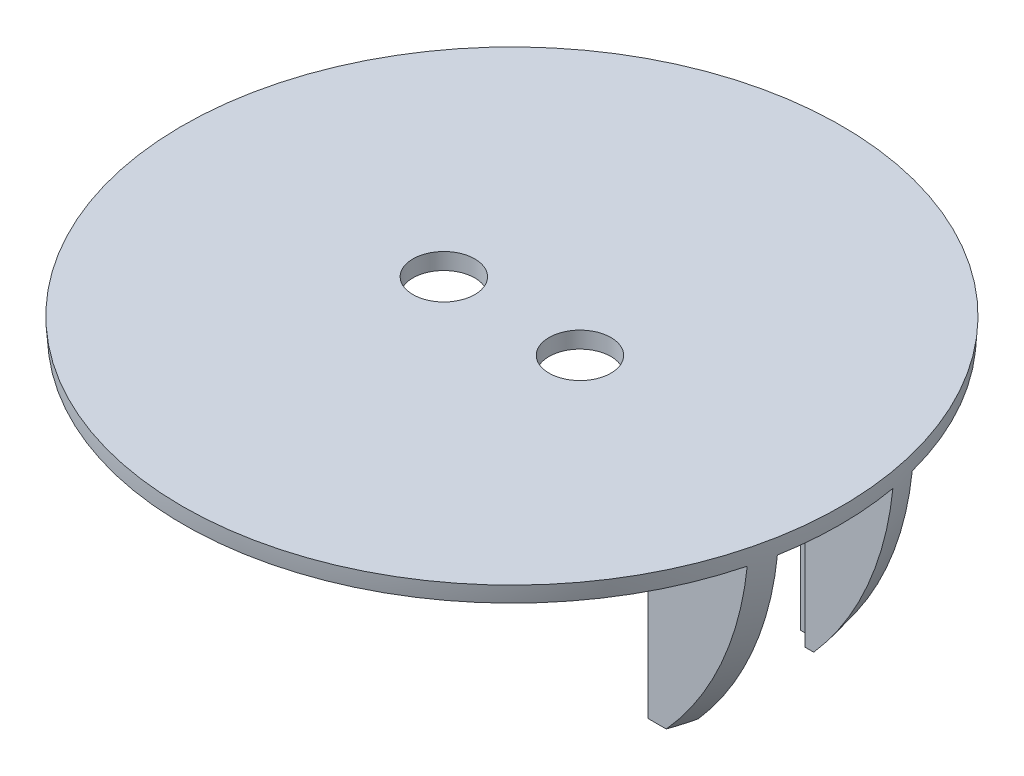
ISO-10303-21;
HEADER;
FILE_DESCRIPTION(('STEP AP214'),'2;1');
FILE_NAME('part.step','',(''),(''),'','','');
FILE_SCHEMA(('AUTOMOTIVE_DESIGN { 1 0 10303 214 1 1 1 1 }'));
ENDSEC;
DATA;
#1=APPLICATION_CONTEXT('core data for automotive mechanical design processes');
#2=APPLICATION_PROTOCOL_DEFINITION('international standard','automotive_design',2000,#1);
#3=PRODUCT_CONTEXT('',#1,'mechanical');
#4=PRODUCT('Part','Part','',(#3));
#5=PRODUCT_RELATED_PRODUCT_CATEGORY('part','',(#4));
#6=PRODUCT_DEFINITION_FORMATION('','',#4);
#7=PRODUCT_DEFINITION_CONTEXT('part definition',#1,'design');
#8=PRODUCT_DEFINITION('design','',#6,#7);
#9=PRODUCT_DEFINITION_SHAPE('','',#8);
#10=(LENGTH_UNIT() NAMED_UNIT(*) SI_UNIT(.MILLI.,.METRE.));
#11=(NAMED_UNIT(*) PLANE_ANGLE_UNIT() SI_UNIT($,.RADIAN.));
#12=(NAMED_UNIT(*) SI_UNIT($,.STERADIAN.) SOLID_ANGLE_UNIT());
#13=UNCERTAINTY_MEASURE_WITH_UNIT(LENGTH_MEASURE(1.E-05),#10,'distance_accuracy_value','');
#14=(GEOMETRIC_REPRESENTATION_CONTEXT(3) GLOBAL_UNCERTAINTY_ASSIGNED_CONTEXT((#13)) GLOBAL_UNIT_ASSIGNED_CONTEXT((#10,
#11,#12)) REPRESENTATION_CONTEXT('',''));
#15=CARTESIAN_POINT('',(0.,0.,0.));
#16=DIRECTION('',(0.,0.,1.));
#17=DIRECTION('',(1.,0.,0.));
#18=AXIS2_PLACEMENT_3D('',#15,#16,#17);
#19=CARTESIAN_POINT('',(41.,-4.00000000000001,0.));
#20=DIRECTION('',(0.,1.,0.));
#21=DIRECTION('',(0.,0.,1.));
#22=AXIS2_PLACEMENT_3D('',#19,#20,#21);
#23=PLANE('',#22);
#24=CARTESIAN_POINT('',(32.75,-4.00000000000001,0.));
#25=DIRECTION('',(0.,-1.,0.));
#26=DIRECTION('',(0.,0.,-1.));
#27=AXIS2_PLACEMENT_3D('',#24,#25,#26);
#28=CIRCLE('',#27,3.75000000000001);
#29=CARTESIAN_POINT('',(32.75,-4.00000000000001,-3.75000000000001));
#30=VERTEX_POINT('',#29);
#31=EDGE_CURVE('E524',#30,#30,#28,.T.);
#32=ORIENTED_EDGE('',*,*,#31,.F.);
#33=EDGE_LOOP('',(#32));
#34=FACE_BOUND('',#33,.T.);
#35=CARTESIAN_POINT('',(49.25,-4.00000000000001,0.));
#36=DIRECTION('',(0.,-1.,0.));
#37=DIRECTION('',(0.,0.,-1.));
#38=AXIS2_PLACEMENT_3D('',#35,#36,#37);
#39=CIRCLE('',#38,3.75000000000001);
#40=CARTESIAN_POINT('',(49.25,-4.00000000000001,-3.75000000000001));
#41=VERTEX_POINT('',#40);
#42=EDGE_CURVE('E516',#41,#41,#39,.T.);
#43=ORIENTED_EDGE('',*,*,#42,.F.);
#44=EDGE_LOOP('',(#43));
#45=FACE_BOUND('',#44,.T.);
#46=DIRECTION('',(1.,0.,0.));
#47=VECTOR('',#46,1.);
#48=CARTESIAN_POINT('',(67.5,-4.00000000000001,-10.));
#49=LINE('',#48,#47);
#50=CARTESIAN_POINT('',(67.5,-4.00000000000001,-10.));
#51=VERTEX_POINT('',#50);
#52=CARTESIAN_POINT('',(79.5227205685165,-4.00000000000001,-9.99999999999997));
#53=VERTEX_POINT('',#52);
#54=EDGE_CURVE('E60',#51,#53,#49,.T.);
#55=ORIENTED_EDGE('',*,*,#54,.F.);
#56=DIRECTION('',(0.,0.,-1.));
#57=VECTOR('',#56,1.);
#58=CARTESIAN_POINT('',(67.5,-4.00000000000001,-8.50000000000001));
#59=LINE('',#58,#57);
#60=CARTESIAN_POINT('',(67.5,-4.00000000000001,-8.50000000000001));
#61=VERTEX_POINT('',#60);
#62=EDGE_CURVE('E65',#61,#51,#59,.T.);
#63=ORIENTED_EDGE('',*,*,#62,.F.);
#64=DIRECTION('',(-1.,0.,0.));
#65=VECTOR('',#64,1.);
#66=CARTESIAN_POINT('',(67.5,-4.00000000000001,-8.50000000000001));
#67=LINE('',#66,#65);
#68=CARTESIAN_POINT('',(69.5,-4.00000000000001,-8.50000000000001));
#69=VERTEX_POINT('',#68);
#70=EDGE_CURVE('E235',#69,#61,#67,.T.);
#71=ORIENTED_EDGE('',*,*,#70,.F.);
#72=DIRECTION('',(0.,0.,-1.));
#73=VECTOR('',#72,1.);
#74=CARTESIAN_POINT('',(69.5,-4.00000000000001,-8.50000000000001));
#75=LINE('',#74,#73);
#76=CARTESIAN_POINT('',(69.5,-4.00000000000001,-7.00000000000001));
#77=VERTEX_POINT('',#76);
#78=EDGE_CURVE('E234',#77,#69,#75,.T.);
#79=ORIENTED_EDGE('',*,*,#78,.F.);
#80=DIRECTION('',(-1.,0.,0.));
#81=VECTOR('',#80,1.);
#82=CARTESIAN_POINT('',(80.1790760483195,-4.00000000000001,-6.99999999999997));
#83=LINE('',#82,#81);
#84=CARTESIAN_POINT('',(80.1790760483195,-4.00000000000001,-6.99999999999997));
#85=VERTEX_POINT('',#84);
#86=EDGE_CURVE('E217',#85,#77,#83,.T.);
#87=ORIENTED_EDGE('',*,*,#86,.F.);
#88=CARTESIAN_POINT('',(41.,-4.00000000000001,0.));
#89=DIRECTION('',(0.,1.,0.));
#90=DIRECTION('',(0.,0.,1.));
#91=AXIS2_PLACEMENT_3D('',#88,#89,#90);
#92=CIRCLE('',#91,39.7994974842648);
#93=CARTESIAN_POINT('',(80.1790760483195,-4.00000000000001,6.99999999999999));
#94=VERTEX_POINT('',#93);
#95=EDGE_CURVE('E53',#94,#85,#92,.T.);
#96=ORIENTED_EDGE('',*,*,#95,.F.);
#97=DIRECTION('',(1.,0.,0.));
#98=VECTOR('',#97,1.);
#99=CARTESIAN_POINT('',(80.1790760483195,-4.00000000000001,6.99999999999999));
#100=LINE('',#99,#98);
#101=CARTESIAN_POINT('',(69.5,-4.00000000000001,6.99999999999999));
#102=VERTEX_POINT('',#101);
#103=EDGE_CURVE('E341',#102,#94,#100,.T.);
#104=ORIENTED_EDGE('',*,*,#103,.F.);
#105=DIRECTION('',(0.,0.,-1.));
#106=VECTOR('',#105,1.);
#107=CARTESIAN_POINT('',(69.5,-4.00000000000001,8.49999999999999));
#108=LINE('',#107,#106);
#109=CARTESIAN_POINT('',(69.5,-4.00000000000001,8.49999999999999));
#110=VERTEX_POINT('',#109);
#111=EDGE_CURVE('E347',#110,#102,#108,.T.);
#112=ORIENTED_EDGE('',*,*,#111,.F.);
#113=DIRECTION('',(1.,0.,0.));
#114=VECTOR('',#113,1.);
#115=CARTESIAN_POINT('',(67.5,-4.00000000000001,8.49999999999999));
#116=LINE('',#115,#114);
#117=CARTESIAN_POINT('',(67.5,-4.00000000000001,8.49999999999999));
#118=VERTEX_POINT('',#117);
#119=EDGE_CURVE('E352',#118,#110,#116,.T.);
#120=ORIENTED_EDGE('',*,*,#119,.F.);
#121=DIRECTION('',(0.,0.,-1.));
#122=VECTOR('',#121,1.);
#123=CARTESIAN_POINT('',(67.5,-4.00000000000001,8.49999999999999));
#124=LINE('',#123,#122);
#125=CARTESIAN_POINT('',(67.5,-4.00000000000001,9.99999999999999));
#126=VERTEX_POINT('',#125);
#127=EDGE_CURVE('E357',#126,#118,#124,.T.);
#128=ORIENTED_EDGE('',*,*,#127,.F.);
#129=DIRECTION('',(-1.,0.,0.));
#130=VECTOR('',#129,1.);
#131=CARTESIAN_POINT('',(67.5,-4.00000000000001,9.99999999999999));
#132=LINE('',#131,#130);
#133=CARTESIAN_POINT('',(79.5227205685165,-4.00000000000001,9.99999999999999));
#134=VERTEX_POINT('',#133);
#135=EDGE_CURVE('E361',#134,#126,#132,.T.);
#136=ORIENTED_EDGE('',*,*,#135,.F.);
#137=CARTESIAN_POINT('',(2.47727943148353,-4.00000000000001,9.99999999999999));
#138=VERTEX_POINT('',#137);
#139=EDGE_CURVE('E51',#138,#134,#92,.T.);
#140=ORIENTED_EDGE('',*,*,#139,.F.);
#141=DIRECTION('',(-1.,0.,0.));
#142=VECTOR('',#141,1.);
#143=CARTESIAN_POINT('',(14.5,-4.00000000000001,9.99999999999999));
#144=LINE('',#143,#142);
#145=CARTESIAN_POINT('',(14.5,-4.00000000000001,9.99999999999999));
#146=VERTEX_POINT('',#145);
#147=EDGE_CURVE('E294',#146,#138,#144,.T.);
#148=ORIENTED_EDGE('',*,*,#147,.F.);
#149=DIRECTION('',(0.,0.,1.));
#150=VECTOR('',#149,1.);
#151=CARTESIAN_POINT('',(14.5,-4.00000000000001,8.49999999999999));
#152=LINE('',#151,#150);
#153=CARTESIAN_POINT('',(14.5,-4.00000000000001,8.49999999999999));
#154=VERTEX_POINT('',#153);
#155=EDGE_CURVE('E274',#154,#146,#152,.T.);
#156=ORIENTED_EDGE('',*,*,#155,.F.);
#157=DIRECTION('',(1.,0.,0.));
#158=VECTOR('',#157,1.);
#159=CARTESIAN_POINT('',(14.5,-4.00000000000001,8.49999999999999));
#160=LINE('',#159,#158);
#161=CARTESIAN_POINT('',(12.5,-4.00000000000001,8.49999999999999));
#162=VERTEX_POINT('',#161);
#163=EDGE_CURVE('E280',#162,#154,#160,.T.);
#164=ORIENTED_EDGE('',*,*,#163,.F.);
#165=DIRECTION('',(0.,0.,1.));
#166=VECTOR('',#165,1.);
#167=CARTESIAN_POINT('',(12.5,-4.00000000000001,8.49999999999999));
#168=LINE('',#167,#166);
#169=CARTESIAN_POINT('',(12.5,-4.00000000000001,6.99999999999999));
#170=VERTEX_POINT('',#169);
#171=EDGE_CURVE('E285',#170,#162,#168,.T.);
#172=ORIENTED_EDGE('',*,*,#171,.F.);
#173=DIRECTION('',(1.,0.,0.));
#174=VECTOR('',#173,1.);
#175=CARTESIAN_POINT('',(1.82092395168051,-4.00000000000001,6.99999999999999));
#176=LINE('',#175,#174);
#177=CARTESIAN_POINT('',(1.82092395168051,-4.00000000000001,6.99999999999999));
#178=VERTEX_POINT('',#177);
#179=EDGE_CURVE('E289',#178,#170,#176,.T.);
#180=ORIENTED_EDGE('',*,*,#179,.F.);
#181=CARTESIAN_POINT('',(1.82092395168051,-4.00000000000001,-6.99999999999997));
#182=VERTEX_POINT('',#181);
#183=EDGE_CURVE('E11',#182,#178,#92,.T.);
#184=ORIENTED_EDGE('',*,*,#183,.F.);
#185=DIRECTION('',(-1.,0.,0.));
#186=VECTOR('',#185,1.);
#187=CARTESIAN_POINT('',(1.82092395168049,-4.00000000000001,-6.99999999999997));
#188=LINE('',#187,#186);
#189=CARTESIAN_POINT('',(12.5,-4.00000000000001,-7.00000000000001));
#190=VERTEX_POINT('',#189);
#191=EDGE_CURVE('E408',#190,#182,#188,.T.);
#192=ORIENTED_EDGE('',*,*,#191,.F.);
#193=DIRECTION('',(0.,0.,1.));
#194=VECTOR('',#193,1.);
#195=CARTESIAN_POINT('',(12.5,-4.00000000000001,-8.50000000000001));
#196=LINE('',#195,#194);
#197=CARTESIAN_POINT('',(12.5,-4.00000000000001,-8.50000000000001));
#198=VERTEX_POINT('',#197);
#199=EDGE_CURVE('E414',#198,#190,#196,.T.);
#200=ORIENTED_EDGE('',*,*,#199,.F.);
#201=DIRECTION('',(-1.,0.,0.));
#202=VECTOR('',#201,1.);
#203=CARTESIAN_POINT('',(14.5,-4.00000000000001,-8.50000000000001));
#204=LINE('',#203,#202);
#205=CARTESIAN_POINT('',(14.5,-4.00000000000001,-8.50000000000001));
#206=VERTEX_POINT('',#205);
#207=EDGE_CURVE('E419',#206,#198,#204,.T.);
#208=ORIENTED_EDGE('',*,*,#207,.F.);
#209=DIRECTION('',(0.,0.,1.));
#210=VECTOR('',#209,1.);
#211=CARTESIAN_POINT('',(14.5,-4.00000000000001,-8.50000000000001));
#212=LINE('',#211,#210);
#213=CARTESIAN_POINT('',(14.5,-4.00000000000001,-10.));
#214=VERTEX_POINT('',#213);
#215=EDGE_CURVE('E424',#214,#206,#212,.T.);
#216=ORIENTED_EDGE('',*,*,#215,.F.);
#217=DIRECTION('',(1.,0.,0.));
#218=VECTOR('',#217,1.);
#219=CARTESIAN_POINT('',(14.5,-4.00000000000001,-10.));
#220=LINE('',#219,#218);
#221=CARTESIAN_POINT('',(2.47727943148353,-4.00000000000001,-9.99999999999998));
#222=VERTEX_POINT('',#221);
#223=EDGE_CURVE('E428',#222,#214,#220,.T.);
#224=ORIENTED_EDGE('',*,*,#223,.F.);
#225=EDGE_CURVE('E52',#53,#222,#92,.T.);
#226=ORIENTED_EDGE('',*,*,#225,.F.);
#227=EDGE_LOOP('',(#55,#63,#71,#79,#87,#96,#104,#112,#120,#128,#136,#140,#148,#156,#164,#172,
#180,#184,#192,#200,#208,#216,#224,#226));
#228=FACE_BOUND('',#227,.T.);
#229=ADVANCED_FACE('F43',(#34,#45,#228),#23,.F.);
#230=CARTESIAN_POINT('',(41.,0.,0.));
#231=DIRECTION('',(0.,1.,0.));
#232=DIRECTION('',(1.,0.,0.));
#233=AXIS2_PLACEMENT_3D('',#230,#231,#232);
#234=SPHERICAL_SURFACE('',#233,40.);
#235=CARTESIAN_POINT('',(41.,-2.00000000000001,0.));
#236=DIRECTION('',(0.,1.,0.));
#237=DIRECTION('',(0.,0.,1.));
#238=AXIS2_PLACEMENT_3D('',#235,#236,#237);
#239=CIRCLE('',#238,39.9499687108764);
#240=CARTESIAN_POINT('',(41.,-2.00000000000001,39.9499687108764));
#241=VERTEX_POINT('',#240);
#242=EDGE_CURVE('E454',#241,#241,#239,.T.);
#243=ORIENTED_EDGE('',*,*,#242,.F.);
#244=EDGE_LOOP('',(#243));
#245=FACE_BOUND('',#244,.T.);
#246=ORIENTED_EDGE('',*,*,#183,.T.);
#247=CARTESIAN_POINT('',(41.,0.,6.99999999999999));
#248=DIRECTION('',(0.,0.,1.));
#249=DIRECTION('',(1.,0.,0.));
#250=AXIS2_PLACEMENT_3D('',#247,#248,#249);
#251=CIRCLE('',#250,39.3827373350304);
#252=CARTESIAN_POINT('',(11.4196010845019,-26.,6.99999999999999));
#253=VERTEX_POINT('',#252);
#254=EDGE_CURVE('E302',#178,#253,#251,.T.);
#255=ORIENTED_EDGE('',*,*,#254,.T.);
#256=CARTESIAN_POINT('',(41.,-26.,0.));
#257=DIRECTION('',(0.,1.,0.));
#258=DIRECTION('',(0.,0.,1.));
#259=AXIS2_PLACEMENT_3D('',#256,#257,#258);
#260=CIRCLE('',#259,30.3973683071413);
#261=CARTESIAN_POINT('',(12.2945998111853,-26.,9.99999999999999));
#262=VERTEX_POINT('',#261);
#263=EDGE_CURVE('E258',#262,#253,#260,.F.);
#264=ORIENTED_EDGE('',*,*,#263,.F.);
#265=CARTESIAN_POINT('',(41.,0.,9.99999999999999));
#266=DIRECTION('',(0.,0.,-1.));
#267=DIRECTION('',(-1.,0.,0.));
#268=AXIS2_PLACEMENT_3D('',#265,#266,#267);
#269=CIRCLE('',#268,38.7298334620742);
#270=EDGE_CURVE('E273',#262,#138,#269,.T.);
#271=ORIENTED_EDGE('',*,*,#270,.T.);
#272=ORIENTED_EDGE('',*,*,#139,.T.);
#273=CARTESIAN_POINT('',(41.,0.,9.99999999999999));
#274=DIRECTION('',(0.,0.,-1.));
#275=DIRECTION('',(-1.,0.,0.));
#276=AXIS2_PLACEMENT_3D('',#273,#274,#275);
#277=CIRCLE('',#276,38.7298334620742);
#278=CARTESIAN_POINT('',(69.7054001888147,-26.,9.99999999999999));
#279=VERTEX_POINT('',#278);
#280=EDGE_CURVE('E340',#134,#279,#277,.T.);
#281=ORIENTED_EDGE('',*,*,#280,.T.);
#282=CARTESIAN_POINT('',(41.,-26.,0.));
#283=DIRECTION('',(0.,1.,0.));
#284=DIRECTION('',(0.,0.,1.));
#285=AXIS2_PLACEMENT_3D('',#282,#283,#284);
#286=CIRCLE('',#285,30.3973683071413);
#287=CARTESIAN_POINT('',(70.5803989154981,-26.,6.99999999999999));
#288=VERTEX_POINT('',#287);
#289=EDGE_CURVE('E337',#288,#279,#286,.F.);
#290=ORIENTED_EDGE('',*,*,#289,.F.);
#291=CARTESIAN_POINT('',(41.,0.,6.99999999999999));
#292=DIRECTION('',(0.,0.,1.));
#293=DIRECTION('',(1.,0.,0.));
#294=AXIS2_PLACEMENT_3D('',#291,#292,#293);
#295=CIRCLE('',#294,39.3827373350304);
#296=EDGE_CURVE('E366',#288,#94,#295,.T.);
#297=ORIENTED_EDGE('',*,*,#296,.T.);
#298=ORIENTED_EDGE('',*,*,#95,.T.);
#299=CARTESIAN_POINT('',(41.,0.,-7.0000000000001));
#300=DIRECTION('',(0.,0.,-1.));
#301=DIRECTION('',(-1.,0.,0.));
#302=AXIS2_PLACEMENT_3D('',#299,#300,#301);
#303=CIRCLE('',#302,39.3827373350304);
#304=CARTESIAN_POINT('',(70.5803989154981,-26.,-7.));
#305=VERTEX_POINT('',#304);
#306=EDGE_CURVE('E244',#85,#305,#303,.T.);
#307=ORIENTED_EDGE('',*,*,#306,.T.);
#308=CARTESIAN_POINT('',(41.,-26.,0.));
#309=DIRECTION('',(0.,1.,0.));
#310=DIRECTION('',(0.,0.,1.));
#311=AXIS2_PLACEMENT_3D('',#308,#309,#310);
#312=CIRCLE('',#311,30.3973683071413);
#313=CARTESIAN_POINT('',(69.7054001888147,-26.,-10.));
#314=VERTEX_POINT('',#313);
#315=EDGE_CURVE('E210',#314,#305,#312,.F.);
#316=ORIENTED_EDGE('',*,*,#315,.F.);
#317=CARTESIAN_POINT('',(41.,0.,-10.0000000000001));
#318=DIRECTION('',(0.,0.,1.));
#319=DIRECTION('',(1.,0.,0.));
#320=AXIS2_PLACEMENT_3D('',#317,#318,#319);
#321=CIRCLE('',#320,38.7298334620742);
#322=EDGE_CURVE('E253',#314,#53,#321,.T.);
#323=ORIENTED_EDGE('',*,*,#322,.T.);
#324=ORIENTED_EDGE('',*,*,#225,.T.);
#325=CARTESIAN_POINT('',(41.,0.,-10.0000000000001));
#326=DIRECTION('',(0.,0.,1.));
#327=DIRECTION('',(1.,0.,0.));
#328=AXIS2_PLACEMENT_3D('',#325,#326,#327);
#329=CIRCLE('',#328,38.7298334620742);
#330=CARTESIAN_POINT('',(12.2945998111853,-26.,-10.));
#331=VERTEX_POINT('',#330);
#332=EDGE_CURVE('E407',#222,#331,#329,.T.);
#333=ORIENTED_EDGE('',*,*,#332,.T.);
#334=CARTESIAN_POINT('',(41.,-26.,0.));
#335=DIRECTION('',(0.,1.,0.));
#336=DIRECTION('',(0.,0.,1.));
#337=AXIS2_PLACEMENT_3D('',#334,#335,#336);
#338=CIRCLE('',#337,30.3973683071413);
#339=CARTESIAN_POINT('',(11.4196010845019,-26.,-7.));
#340=VERTEX_POINT('',#339);
#341=EDGE_CURVE('E404',#340,#331,#338,.F.);
#342=ORIENTED_EDGE('',*,*,#341,.F.);
#343=CARTESIAN_POINT('',(41.,0.,-7.0000000000001));
#344=DIRECTION('',(0.,0.,-1.));
#345=DIRECTION('',(-1.,0.,0.));
#346=AXIS2_PLACEMENT_3D('',#343,#344,#345);
#347=CIRCLE('',#346,39.3827373350304);
#348=EDGE_CURVE('E433',#340,#182,#347,.T.);
#349=ORIENTED_EDGE('',*,*,#348,.T.);
#350=EDGE_LOOP('',(#246,#255,#264,#271,#272,#281,#290,#297,#298,#307,#316,#323,#324,#333,#342,#349));
#351=FACE_BOUND('',#350,.T.);
#352=ADVANCED_FACE('F467',(#245,#351),#234,.T.);
#353=CARTESIAN_POINT('',(41.,-2.00000000000001,0.));
#354=DIRECTION('',(0.,-1.,0.));
#355=DIRECTION('',(0.,0.,-1.));
#356=AXIS2_PLACEMENT_3D('',#353,#354,#355);
#357=PLANE('',#356);
#358=CARTESIAN_POINT('',(32.75,-2.00000000000001,0.));
#359=DIRECTION('',(0.,-1.,0.));
#360=DIRECTION('',(0.,0.,-1.));
#361=AXIS2_PLACEMENT_3D('',#358,#359,#360);
#362=CIRCLE('',#361,3.75000000000001);
#363=CARTESIAN_POINT('',(32.75,-2.00000000000001,-3.75000000000001));
#364=VERTEX_POINT('',#363);
#365=EDGE_CURVE('E230',#364,#364,#362,.T.);
#366=ORIENTED_EDGE('',*,*,#365,.T.);
#367=EDGE_LOOP('',(#366));
#368=FACE_BOUND('',#367,.T.);
#369=CARTESIAN_POINT('',(49.25,-2.00000000000001,0.));
#370=DIRECTION('',(0.,-1.,0.));
#371=DIRECTION('',(0.,0.,-1.));
#372=AXIS2_PLACEMENT_3D('',#369,#370,#371);
#373=CIRCLE('',#372,3.75000000000001);
#374=CARTESIAN_POINT('',(49.25,-2.00000000000001,-3.75000000000001));
#375=VERTEX_POINT('',#374);
#376=EDGE_CURVE('E520',#375,#375,#373,.T.);
#377=ORIENTED_EDGE('',*,*,#376,.T.);
#378=EDGE_LOOP('',(#377));
#379=FACE_BOUND('',#378,.T.);
#380=ORIENTED_EDGE('',*,*,#242,.T.);
#381=EDGE_LOOP('',(#380));
#382=FACE_BOUND('',#381,.T.);
#383=ADVANCED_FACE('F532',(#368,#379,#382),#357,.F.);
#384=CARTESIAN_POINT('',(1.82092395168049,-40.001,-6.99999999999997));
#385=DIRECTION('',(0.,0.,-1.));
#386=DIRECTION('',(-1.,0.,0.));
#387=AXIS2_PLACEMENT_3D('',#384,#385,#386);
#388=PLANE('',#387);
#389=ORIENTED_EDGE('',*,*,#348,.F.);
#390=DIRECTION('',(1.,0.,0.));
#391=VECTOR('',#390,1.);
#392=CARTESIAN_POINT('',(1.82092395168049,-26.,-6.99999999999997));
#393=LINE('',#392,#391);
#394=CARTESIAN_POINT('',(12.5,-26.,-7.00000000000001));
#395=VERTEX_POINT('',#394);
#396=EDGE_CURVE('E400',#340,#395,#393,.T.);
#397=ORIENTED_EDGE('',*,*,#396,.T.);
#398=DIRECTION('',(0.,1.,0.));
#399=VECTOR('',#398,1.);
#400=CARTESIAN_POINT('',(12.5,-40.001,-7.00000000000001));
#401=LINE('',#400,#399);
#402=EDGE_CURVE('E413',#395,#190,#401,.T.);
#403=ORIENTED_EDGE('',*,*,#402,.T.);
#404=ORIENTED_EDGE('',*,*,#191,.T.);
#405=EDGE_LOOP('',(#389,#397,#403,#404));
#406=FACE_BOUND('',#405,.T.);
#407=ADVANCED_FACE('F622',(#406),#388,.F.);
#408=CARTESIAN_POINT('',(12.5,-40.001,-8.50000000000001));
#409=DIRECTION('',(-1.,0.,0.));
#410=DIRECTION('',(0.,0.,1.));
#411=AXIS2_PLACEMENT_3D('',#408,#409,#410);
#412=PLANE('',#411);
#413=ORIENTED_EDGE('',*,*,#402,.F.);
#414=DIRECTION('',(0.,0.,-1.));
#415=VECTOR('',#414,1.);
#416=CARTESIAN_POINT('',(12.5,-26.,-8.50000000000001));
#417=LINE('',#416,#415);
#418=CARTESIAN_POINT('',(12.5,-26.,-8.50000000000001));
#419=VERTEX_POINT('',#418);
#420=EDGE_CURVE('E396',#395,#419,#417,.T.);
#421=ORIENTED_EDGE('',*,*,#420,.T.);
#422=DIRECTION('',(0.,1.,0.));
#423=VECTOR('',#422,1.);
#424=CARTESIAN_POINT('',(12.5,-40.001,-8.50000000000001));
#425=LINE('',#424,#423);
#426=EDGE_CURVE('E412',#419,#198,#425,.T.);
#427=ORIENTED_EDGE('',*,*,#426,.T.);
#428=ORIENTED_EDGE('',*,*,#199,.T.);
#429=EDGE_LOOP('',(#413,#421,#427,#428));
#430=FACE_BOUND('',#429,.T.);
#431=ADVANCED_FACE('F618',(#430),#412,.F.);
#432=CARTESIAN_POINT('',(14.5,-40.001,-8.50000000000001));
#433=DIRECTION('',(0.,0.,-1.));
#434=DIRECTION('',(-1.,0.,0.));
#435=AXIS2_PLACEMENT_3D('',#432,#433,#434);
#436=PLANE('',#435);
#437=ORIENTED_EDGE('',*,*,#426,.F.);
#438=DIRECTION('',(1.,0.,0.));
#439=VECTOR('',#438,1.);
#440=CARTESIAN_POINT('',(14.5,-26.,-8.50000000000001));
#441=LINE('',#440,#439);
#442=CARTESIAN_POINT('',(14.5,-26.,-8.50000000000001));
#443=VERTEX_POINT('',#442);
#444=EDGE_CURVE('E392',#419,#443,#441,.T.);
#445=ORIENTED_EDGE('',*,*,#444,.T.);
#446=DIRECTION('',(0.,1.,0.));
#447=VECTOR('',#446,1.);
#448=CARTESIAN_POINT('',(14.5,-40.001,-8.50000000000001));
#449=LINE('',#448,#447);
#450=EDGE_CURVE('E418',#443,#206,#449,.T.);
#451=ORIENTED_EDGE('',*,*,#450,.T.);
#452=ORIENTED_EDGE('',*,*,#207,.T.);
#453=EDGE_LOOP('',(#437,#445,#451,#452));
#454=FACE_BOUND('',#453,.T.);
#455=ADVANCED_FACE('F614',(#454),#436,.F.);
#456=CARTESIAN_POINT('',(14.5,-40.001,-8.50000000000001));
#457=DIRECTION('',(-1.,0.,0.));
#458=DIRECTION('',(0.,0.,1.));
#459=AXIS2_PLACEMENT_3D('',#456,#457,#458);
#460=PLANE('',#459);
#461=ORIENTED_EDGE('',*,*,#450,.F.);
#462=DIRECTION('',(0.,0.,-1.));
#463=VECTOR('',#462,1.);
#464=CARTESIAN_POINT('',(14.5,-26.,-8.50000000000001));
#465=LINE('',#464,#463);
#466=CARTESIAN_POINT('',(14.5,-26.,-10.));
#467=VERTEX_POINT('',#466);
#468=EDGE_CURVE('E388',#443,#467,#465,.T.);
#469=ORIENTED_EDGE('',*,*,#468,.T.);
#470=DIRECTION('',(0.,1.,0.));
#471=VECTOR('',#470,1.);
#472=CARTESIAN_POINT('',(14.5,-40.001,-10.));
#473=LINE('',#472,#471);
#474=EDGE_CURVE('E423',#467,#214,#473,.T.);
#475=ORIENTED_EDGE('',*,*,#474,.T.);
#476=ORIENTED_EDGE('',*,*,#215,.T.);
#477=EDGE_LOOP('',(#461,#469,#475,#476));
#478=FACE_BOUND('',#477,.T.);
#479=ADVANCED_FACE('F610',(#478),#460,.F.);
#480=CARTESIAN_POINT('',(14.5,-40.001,-10.));
#481=DIRECTION('',(0.,0.,1.));
#482=DIRECTION('',(1.,0.,0.));
#483=AXIS2_PLACEMENT_3D('',#480,#481,#482);
#484=PLANE('',#483);
#485=ORIENTED_EDGE('',*,*,#474,.F.);
#486=DIRECTION('',(-1.,0.,0.));
#487=VECTOR('',#486,1.);
#488=CARTESIAN_POINT('',(14.5,-26.,-10.));
#489=LINE('',#488,#487);
#490=EDGE_CURVE('E432',#467,#331,#489,.T.);
#491=ORIENTED_EDGE('',*,*,#490,.T.);
#492=ORIENTED_EDGE('',*,*,#332,.F.);
#493=ORIENTED_EDGE('',*,*,#223,.T.);
#494=EDGE_LOOP('',(#485,#491,#492,#493));
#495=FACE_BOUND('',#494,.T.);
#496=ADVANCED_FACE('F606',(#495),#484,.F.);
#497=CARTESIAN_POINT('',(10.145502758917,-26.,-41.));
#498=DIRECTION('',(0.,1.,0.));
#499=DIRECTION('',(0.,0.,1.));
#500=AXIS2_PLACEMENT_3D('',#497,#498,#499);
#501=PLANE('',#500);
#502=ORIENTED_EDGE('',*,*,#341,.T.);
#503=ORIENTED_EDGE('',*,*,#490,.F.);
#504=ORIENTED_EDGE('',*,*,#468,.F.);
#505=ORIENTED_EDGE('',*,*,#444,.F.);
#506=ORIENTED_EDGE('',*,*,#420,.F.);
#507=ORIENTED_EDGE('',*,*,#396,.F.);
#508=EDGE_LOOP('',(#502,#503,#504,#505,#506,#507));
#509=FACE_BOUND('',#508,.T.);
#510=ADVANCED_FACE('F603',(#509),#501,.F.);
#511=CARTESIAN_POINT('',(80.1790760483195,-40.001,6.99999999999999));
#512=DIRECTION('',(0.,0.,1.));
#513=DIRECTION('',(1.,0.,0.));
#514=AXIS2_PLACEMENT_3D('',#511,#512,#513);
#515=PLANE('',#514);
#516=ORIENTED_EDGE('',*,*,#296,.F.);
#517=DIRECTION('',(-1.,0.,0.));
#518=VECTOR('',#517,1.);
#519=CARTESIAN_POINT('',(80.1790760483195,-26.,6.99999999999999));
#520=LINE('',#519,#518);
#521=CARTESIAN_POINT('',(69.5,-26.,6.99999999999999));
#522=VERTEX_POINT('',#521);
#523=EDGE_CURVE('E333',#288,#522,#520,.T.);
#524=ORIENTED_EDGE('',*,*,#523,.T.);
#525=DIRECTION('',(0.,1.,0.));
#526=VECTOR('',#525,1.);
#527=CARTESIAN_POINT('',(69.5,-40.001,6.99999999999999));
#528=LINE('',#527,#526);
#529=EDGE_CURVE('E346',#522,#102,#528,.T.);
#530=ORIENTED_EDGE('',*,*,#529,.T.);
#531=ORIENTED_EDGE('',*,*,#103,.T.);
#532=EDGE_LOOP('',(#516,#524,#530,#531));
#533=FACE_BOUND('',#532,.T.);
#534=ADVANCED_FACE('F488',(#533),#515,.F.);
#535=CARTESIAN_POINT('',(69.5,-40.001,8.49999999999999));
#536=DIRECTION('',(1.,0.,0.));
#537=DIRECTION('',(0.,0.,-1.));
#538=AXIS2_PLACEMENT_3D('',#535,#536,#537);
#539=PLANE('',#538);
#540=ORIENTED_EDGE('',*,*,#529,.F.);
#541=DIRECTION('',(0.,0.,1.));
#542=VECTOR('',#541,1.);
#543=CARTESIAN_POINT('',(69.5,-26.,8.49999999999999));
#544=LINE('',#543,#542);
#545=CARTESIAN_POINT('',(69.5,-26.,8.49999999999999));
#546=VERTEX_POINT('',#545);
#547=EDGE_CURVE('E329',#522,#546,#544,.T.);
#548=ORIENTED_EDGE('',*,*,#547,.T.);
#549=DIRECTION('',(0.,1.,0.));
#550=VECTOR('',#549,1.);
#551=CARTESIAN_POINT('',(69.5,-40.001,8.49999999999999));
#552=LINE('',#551,#550);
#553=EDGE_CURVE('E345',#546,#110,#552,.T.);
#554=ORIENTED_EDGE('',*,*,#553,.T.);
#555=ORIENTED_EDGE('',*,*,#111,.T.);
#556=EDGE_LOOP('',(#540,#548,#554,#555));
#557=FACE_BOUND('',#556,.T.);
#558=ADVANCED_FACE('F485',(#557),#539,.F.);
#559=CARTESIAN_POINT('',(67.5,-40.001,8.49999999999999));
#560=DIRECTION('',(0.,0.,1.));
#561=DIRECTION('',(1.,0.,0.));
#562=AXIS2_PLACEMENT_3D('',#559,#560,#561);
#563=PLANE('',#562);
#564=ORIENTED_EDGE('',*,*,#553,.F.);
#565=DIRECTION('',(-1.,0.,0.));
#566=VECTOR('',#565,1.);
#567=CARTESIAN_POINT('',(67.5,-26.,8.49999999999999));
#568=LINE('',#567,#566);
#569=CARTESIAN_POINT('',(67.5,-26.,8.49999999999999));
#570=VERTEX_POINT('',#569);
#571=EDGE_CURVE('E325',#546,#570,#568,.T.);
#572=ORIENTED_EDGE('',*,*,#571,.T.);
#573=DIRECTION('',(0.,1.,0.));
#574=VECTOR('',#573,1.);
#575=CARTESIAN_POINT('',(67.5,-40.001,8.49999999999999));
#576=LINE('',#575,#574);
#577=EDGE_CURVE('E351',#570,#118,#576,.T.);
#578=ORIENTED_EDGE('',*,*,#577,.T.);
#579=ORIENTED_EDGE('',*,*,#119,.T.);
#580=EDGE_LOOP('',(#564,#572,#578,#579));
#581=FACE_BOUND('',#580,.T.);
#582=ADVANCED_FACE('F482',(#581),#563,.F.);
#583=CARTESIAN_POINT('',(67.5,-40.001,8.49999999999999));
#584=DIRECTION('',(1.,0.,0.));
#585=DIRECTION('',(0.,0.,-1.));
#586=AXIS2_PLACEMENT_3D('',#583,#584,#585);
#587=PLANE('',#586);
#588=ORIENTED_EDGE('',*,*,#577,.F.);
#589=DIRECTION('',(0.,0.,1.));
#590=VECTOR('',#589,1.);
#591=CARTESIAN_POINT('',(67.5,-26.,8.49999999999999));
#592=LINE('',#591,#590);
#593=CARTESIAN_POINT('',(67.5,-26.,9.99999999999999));
#594=VERTEX_POINT('',#593);
#595=EDGE_CURVE('E321',#570,#594,#592,.T.);
#596=ORIENTED_EDGE('',*,*,#595,.T.);
#597=DIRECTION('',(0.,1.,0.));
#598=VECTOR('',#597,1.);
#599=CARTESIAN_POINT('',(67.5,-40.001,9.99999999999999));
#600=LINE('',#599,#598);
#601=EDGE_CURVE('E356',#594,#126,#600,.T.);
#602=ORIENTED_EDGE('',*,*,#601,.T.);
#603=ORIENTED_EDGE('',*,*,#127,.T.);
#604=EDGE_LOOP('',(#588,#596,#602,#603));
#605=FACE_BOUND('',#604,.T.);
#606=ADVANCED_FACE('F479',(#605),#587,.F.);
#607=CARTESIAN_POINT('',(67.5,-40.001,9.99999999999999));
#608=DIRECTION('',(0.,0.,-1.));
#609=DIRECTION('',(-1.,0.,0.));
#610=AXIS2_PLACEMENT_3D('',#607,#608,#609);
#611=PLANE('',#610);
#612=ORIENTED_EDGE('',*,*,#601,.F.);
#613=DIRECTION('',(1.,0.,0.));
#614=VECTOR('',#613,1.);
#615=CARTESIAN_POINT('',(67.5,-26.,9.99999999999999));
#616=LINE('',#615,#614);
#617=EDGE_CURVE('E365',#594,#279,#616,.T.);
#618=ORIENTED_EDGE('',*,*,#617,.T.);
#619=ORIENTED_EDGE('',*,*,#280,.F.);
#620=ORIENTED_EDGE('',*,*,#135,.T.);
#621=EDGE_LOOP('',(#612,#618,#619,#620));
#622=FACE_BOUND('',#621,.T.);
#623=ADVANCED_FACE('F474',(#622),#611,.F.);
#624=CARTESIAN_POINT('',(10.145502758917,-26.,-41.));
#625=DIRECTION('',(0.,1.,0.));
#626=DIRECTION('',(0.,0.,1.));
#627=AXIS2_PLACEMENT_3D('',#624,#625,#626);
#628=PLANE('',#627);
#629=ORIENTED_EDGE('',*,*,#289,.T.);
#630=ORIENTED_EDGE('',*,*,#617,.F.);
#631=ORIENTED_EDGE('',*,*,#595,.F.);
#632=ORIENTED_EDGE('',*,*,#571,.F.);
#633=ORIENTED_EDGE('',*,*,#547,.F.);
#634=ORIENTED_EDGE('',*,*,#523,.F.);
#635=EDGE_LOOP('',(#629,#630,#631,#632,#633,#634));
#636=FACE_BOUND('',#635,.T.);
#637=ADVANCED_FACE('F476',(#636),#628,.F.);
#638=CARTESIAN_POINT('',(14.5,-40.001,8.49999999999999));
#639=DIRECTION('',(-1.,0.,0.));
#640=DIRECTION('',(0.,0.,1.));
#641=AXIS2_PLACEMENT_3D('',#638,#639,#640);
#642=PLANE('',#641);
#643=DIRECTION('',(0.,1.,0.));
#644=VECTOR('',#643,1.);
#645=CARTESIAN_POINT('',(14.5,-40.001,9.99999999999999));
#646=LINE('',#645,#644);
#647=CARTESIAN_POINT('',(14.5,-26.,9.99999999999999));
#648=VERTEX_POINT('',#647);
#649=EDGE_CURVE('E293',#648,#146,#646,.T.);
#650=ORIENTED_EDGE('',*,*,#649,.F.);
#651=DIRECTION('',(0.,0.,-1.));
#652=VECTOR('',#651,1.);
#653=CARTESIAN_POINT('',(14.5,-26.,8.49999999999999));
#654=LINE('',#653,#652);
#655=CARTESIAN_POINT('',(14.5,-26.,8.49999999999999));
#656=VERTEX_POINT('',#655);
#657=EDGE_CURVE('E216',#648,#656,#654,.T.);
#658=ORIENTED_EDGE('',*,*,#657,.T.);
#659=DIRECTION('',(0.,1.,0.));
#660=VECTOR('',#659,1.);
#661=CARTESIAN_POINT('',(14.5,-40.001,8.49999999999999));
#662=LINE('',#661,#660);
#663=EDGE_CURVE('E279',#656,#154,#662,.T.);
#664=ORIENTED_EDGE('',*,*,#663,.T.);
#665=ORIENTED_EDGE('',*,*,#155,.T.);
#666=EDGE_LOOP('',(#650,#658,#664,#665));
#667=FACE_BOUND('',#666,.T.);
#668=ADVANCED_FACE('F586',(#667),#642,.F.);
#669=CARTESIAN_POINT('',(14.5,-40.001,8.49999999999999));
#670=DIRECTION('',(0.,0.,1.));
#671=DIRECTION('',(1.,0.,0.));
#672=AXIS2_PLACEMENT_3D('',#669,#670,#671);
#673=PLANE('',#672);
#674=ORIENTED_EDGE('',*,*,#663,.F.);
#675=DIRECTION('',(-1.,0.,0.));
#676=VECTOR('',#675,1.);
#677=CARTESIAN_POINT('',(14.5,-26.,8.49999999999999));
#678=LINE('',#677,#676);
#679=CARTESIAN_POINT('',(12.5,-26.,8.49999999999999));
#680=VERTEX_POINT('',#679);
#681=EDGE_CURVE('E269',#656,#680,#678,.T.);
#682=ORIENTED_EDGE('',*,*,#681,.T.);
#683=DIRECTION('',(0.,1.,0.));
#684=VECTOR('',#683,1.);
#685=CARTESIAN_POINT('',(12.5,-40.001,8.49999999999999));
#686=LINE('',#685,#684);
#687=EDGE_CURVE('E278',#680,#162,#686,.T.);
#688=ORIENTED_EDGE('',*,*,#687,.T.);
#689=ORIENTED_EDGE('',*,*,#163,.T.);
#690=EDGE_LOOP('',(#674,#682,#688,#689));
#691=FACE_BOUND('',#690,.T.);
#692=ADVANCED_FACE('F582',(#691),#673,.F.);
#693=CARTESIAN_POINT('',(12.5,-40.001,8.49999999999999));
#694=DIRECTION('',(-1.,0.,0.));
#695=DIRECTION('',(0.,0.,1.));
#696=AXIS2_PLACEMENT_3D('',#693,#694,#695);
#697=PLANE('',#696);
#698=ORIENTED_EDGE('',*,*,#687,.F.);
#699=DIRECTION('',(0.,0.,-1.));
#700=VECTOR('',#699,1.);
#701=CARTESIAN_POINT('',(12.5,-26.,8.49999999999999));
#702=LINE('',#701,#700);
#703=CARTESIAN_POINT('',(12.5,-26.,6.99999999999999));
#704=VERTEX_POINT('',#703);
#705=EDGE_CURVE('E265',#680,#704,#702,.T.);
#706=ORIENTED_EDGE('',*,*,#705,.T.);
#707=DIRECTION('',(0.,1.,0.));
#708=VECTOR('',#707,1.);
#709=CARTESIAN_POINT('',(12.5,-40.001,6.99999999999999));
#710=LINE('',#709,#708);
#711=EDGE_CURVE('E284',#704,#170,#710,.T.);
#712=ORIENTED_EDGE('',*,*,#711,.T.);
#713=ORIENTED_EDGE('',*,*,#171,.T.);
#714=EDGE_LOOP('',(#698,#706,#712,#713));
#715=FACE_BOUND('',#714,.T.);
#716=ADVANCED_FACE('F578',(#715),#697,.F.);
#717=CARTESIAN_POINT('',(1.82092395168051,-40.001,6.99999999999999));
#718=DIRECTION('',(0.,0.,1.));
#719=DIRECTION('',(1.,0.,0.));
#720=AXIS2_PLACEMENT_3D('',#717,#718,#719);
#721=PLANE('',#720);
#722=ORIENTED_EDGE('',*,*,#711,.F.);
#723=DIRECTION('',(-1.,0.,0.));
#724=VECTOR('',#723,1.);
#725=CARTESIAN_POINT('',(1.82092395168051,-26.,6.99999999999999));
#726=LINE('',#725,#724);
#727=EDGE_CURVE('E261',#704,#253,#726,.T.);
#728=ORIENTED_EDGE('',*,*,#727,.T.);
#729=ORIENTED_EDGE('',*,*,#254,.F.);
#730=ORIENTED_EDGE('',*,*,#179,.T.);
#731=EDGE_LOOP('',(#722,#728,#729,#730));
#732=FACE_BOUND('',#731,.T.);
#733=ADVANCED_FACE('F574',(#732),#721,.F.);
#734=CARTESIAN_POINT('',(14.5,-40.001,9.99999999999999));
#735=DIRECTION('',(0.,0.,-1.));
#736=DIRECTION('',(-1.,0.,0.));
#737=AXIS2_PLACEMENT_3D('',#734,#735,#736);
#738=PLANE('',#737);
#739=ORIENTED_EDGE('',*,*,#270,.F.);
#740=DIRECTION('',(1.,0.,0.));
#741=VECTOR('',#740,1.);
#742=CARTESIAN_POINT('',(14.5,-26.,9.99999999999999));
#743=LINE('',#742,#741);
#744=EDGE_CURVE('E298',#262,#648,#743,.T.);
#745=ORIENTED_EDGE('',*,*,#744,.T.);
#746=ORIENTED_EDGE('',*,*,#649,.T.);
#747=ORIENTED_EDGE('',*,*,#147,.T.);
#748=EDGE_LOOP('',(#739,#745,#746,#747));
#749=FACE_BOUND('',#748,.T.);
#750=ADVANCED_FACE('F570',(#749),#738,.F.);
#751=CARTESIAN_POINT('',(10.145502758917,-26.,-41.));
#752=DIRECTION('',(0.,1.,0.));
#753=DIRECTION('',(0.,0.,1.));
#754=AXIS2_PLACEMENT_3D('',#751,#752,#753);
#755=PLANE('',#754);
#756=ORIENTED_EDGE('',*,*,#657,.F.);
#757=ORIENTED_EDGE('',*,*,#744,.F.);
#758=ORIENTED_EDGE('',*,*,#263,.T.);
#759=ORIENTED_EDGE('',*,*,#727,.F.);
#760=ORIENTED_EDGE('',*,*,#705,.F.);
#761=ORIENTED_EDGE('',*,*,#681,.F.);
#762=EDGE_LOOP('',(#756,#757,#758,#759,#760,#761));
#763=FACE_BOUND('',#762,.T.);
#764=ADVANCED_FACE('F566',(#763),#755,.F.);
#765=CARTESIAN_POINT('',(67.5,-40.001,-10.));
#766=DIRECTION('',(0.,0.,1.));
#767=DIRECTION('',(1.,0.,0.));
#768=AXIS2_PLACEMENT_3D('',#765,#766,#767);
#769=PLANE('',#768);
#770=ORIENTED_EDGE('',*,*,#322,.F.);
#771=DIRECTION('',(-1.,0.,0.));
#772=VECTOR('',#771,1.);
#773=CARTESIAN_POINT('',(67.5,-26.,-10.));
#774=LINE('',#773,#772);
#775=CARTESIAN_POINT('',(67.5,-26.,-10.));
#776=VERTEX_POINT('',#775);
#777=EDGE_CURVE('E492',#314,#776,#774,.T.);
#778=ORIENTED_EDGE('',*,*,#777,.T.);
#779=DIRECTION('',(0.,1.,0.));
#780=VECTOR('',#779,1.);
#781=CARTESIAN_POINT('',(67.5,-40.001,-10.));
#782=LINE('',#781,#780);
#783=EDGE_CURVE('E251',#776,#51,#782,.T.);
#784=ORIENTED_EDGE('',*,*,#783,.T.);
#785=ORIENTED_EDGE('',*,*,#54,.T.);
#786=EDGE_LOOP('',(#770,#778,#784,#785));
#787=FACE_BOUND('',#786,.T.);
#788=ADVANCED_FACE('F563',(#787),#769,.F.);
#789=CARTESIAN_POINT('',(67.5,-40.001,-8.50000000000001));
#790=DIRECTION('',(1.,0.,0.));
#791=DIRECTION('',(0.,0.,-1.));
#792=AXIS2_PLACEMENT_3D('',#789,#790,#791);
#793=PLANE('',#792);
#794=ORIENTED_EDGE('',*,*,#783,.F.);
#795=DIRECTION('',(0.,0.,1.));
#796=VECTOR('',#795,1.);
#797=CARTESIAN_POINT('',(67.5,-26.,-8.50000000000001));
#798=LINE('',#797,#796);
#799=CARTESIAN_POINT('',(67.5,-26.,-8.50000000000001));
#800=VERTEX_POINT('',#799);
#801=EDGE_CURVE('E496',#776,#800,#798,.T.);
#802=ORIENTED_EDGE('',*,*,#801,.T.);
#803=DIRECTION('',(0.,1.,0.));
#804=VECTOR('',#803,1.);
#805=CARTESIAN_POINT('',(67.5,-40.001,-8.50000000000001));
#806=LINE('',#805,#804);
#807=EDGE_CURVE('E248',#800,#61,#806,.T.);
#808=ORIENTED_EDGE('',*,*,#807,.T.);
#809=ORIENTED_EDGE('',*,*,#62,.T.);
#810=EDGE_LOOP('',(#794,#802,#808,#809));
#811=FACE_BOUND('',#810,.T.);
#812=ADVANCED_FACE('F507',(#811),#793,.F.);
#813=CARTESIAN_POINT('',(67.5,-40.001,-8.50000000000001));
#814=DIRECTION('',(0.,0.,-1.));
#815=DIRECTION('',(-1.,0.,0.));
#816=AXIS2_PLACEMENT_3D('',#813,#814,#815);
#817=PLANE('',#816);
#818=ORIENTED_EDGE('',*,*,#807,.F.);
#819=DIRECTION('',(1.,0.,0.));
#820=VECTOR('',#819,1.);
#821=CARTESIAN_POINT('',(67.5,-26.,-8.50000000000001));
#822=LINE('',#821,#820);
#823=CARTESIAN_POINT('',(69.5,-26.,-8.50000000000001));
#824=VERTEX_POINT('',#823);
#825=EDGE_CURVE('E229',#800,#824,#822,.T.);
#826=ORIENTED_EDGE('',*,*,#825,.T.);
#827=DIRECTION('',(0.,1.,0.));
#828=VECTOR('',#827,1.);
#829=CARTESIAN_POINT('',(69.5,-40.001,-8.50000000000001));
#830=LINE('',#829,#828);
#831=EDGE_CURVE('E227',#824,#69,#830,.T.);
#832=ORIENTED_EDGE('',*,*,#831,.T.);
#833=ORIENTED_EDGE('',*,*,#70,.T.);
#834=EDGE_LOOP('',(#818,#826,#832,#833));
#835=FACE_BOUND('',#834,.T.);
#836=ADVANCED_FACE('F511',(#835),#817,.F.);
#837=CARTESIAN_POINT('',(69.5,-40.001,-8.50000000000001));
#838=DIRECTION('',(1.,0.,0.));
#839=DIRECTION('',(0.,0.,-1.));
#840=AXIS2_PLACEMENT_3D('',#837,#838,#839);
#841=PLANE('',#840);
#842=ORIENTED_EDGE('',*,*,#831,.F.);
#843=DIRECTION('',(0.,0.,1.));
#844=VECTOR('',#843,1.);
#845=CARTESIAN_POINT('',(69.5,-26.,-8.50000000000001));
#846=LINE('',#845,#844);
#847=CARTESIAN_POINT('',(69.5,-26.,-7.00000000000001));
#848=VERTEX_POINT('',#847);
#849=EDGE_CURVE('E207',#824,#848,#846,.T.);
#850=ORIENTED_EDGE('',*,*,#849,.T.);
#851=DIRECTION('',(0.,1.,0.));
#852=VECTOR('',#851,1.);
#853=CARTESIAN_POINT('',(69.5,-40.001,-7.00000000000001));
#854=LINE('',#853,#852);
#855=EDGE_CURVE('E224',#848,#77,#854,.T.);
#856=ORIENTED_EDGE('',*,*,#855,.T.);
#857=ORIENTED_EDGE('',*,*,#78,.T.);
#858=EDGE_LOOP('',(#842,#850,#856,#857));
#859=FACE_BOUND('',#858,.T.);
#860=ADVANCED_FACE('F222',(#859),#841,.F.);
#861=CARTESIAN_POINT('',(80.1790760483195,-40.001,-6.99999999999997));
#862=DIRECTION('',(0.,0.,-1.));
#863=DIRECTION('',(-1.,0.,0.));
#864=AXIS2_PLACEMENT_3D('',#861,#862,#863);
#865=PLANE('',#864);
#866=ORIENTED_EDGE('',*,*,#855,.F.);
#867=DIRECTION('',(1.,0.,0.));
#868=VECTOR('',#867,1.);
#869=CARTESIAN_POINT('',(80.1790760483195,-26.,-6.99999999999997));
#870=LINE('',#869,#868);
#871=EDGE_CURVE('E204',#848,#305,#870,.T.);
#872=ORIENTED_EDGE('',*,*,#871,.T.);
#873=ORIENTED_EDGE('',*,*,#306,.F.);
#874=ORIENTED_EDGE('',*,*,#86,.T.);
#875=EDGE_LOOP('',(#866,#872,#873,#874));
#876=FACE_BOUND('',#875,.T.);
#877=ADVANCED_FACE('F232',(#876),#865,.F.);
#878=CARTESIAN_POINT('',(10.145502758917,-26.,-41.));
#879=DIRECTION('',(0.,1.,0.));
#880=DIRECTION('',(0.,0.,1.));
#881=AXIS2_PLACEMENT_3D('',#878,#879,#880);
#882=PLANE('',#881);
#883=ORIENTED_EDGE('',*,*,#315,.T.);
#884=ORIENTED_EDGE('',*,*,#871,.F.);
#885=ORIENTED_EDGE('',*,*,#849,.F.);
#886=ORIENTED_EDGE('',*,*,#825,.F.);
#887=ORIENTED_EDGE('',*,*,#801,.F.);
#888=ORIENTED_EDGE('',*,*,#777,.F.);
#889=EDGE_LOOP('',(#883,#884,#885,#886,#887,#888));
#890=FACE_BOUND('',#889,.T.);
#891=ADVANCED_FACE('F206',(#890),#882,.F.);
#892=CARTESIAN_POINT('',(49.25,-2.00000000000001,0.));
#893=DIRECTION('',(0.,-1.,0.));
#894=DIRECTION('',(0.,0.,-1.));
#895=AXIS2_PLACEMENT_3D('',#892,#893,#894);
#896=CYLINDRICAL_SURFACE('',#895,3.75000000000001);
#897=ORIENTED_EDGE('',*,*,#376,.F.);
#898=EDGE_LOOP('',(#897));
#899=FACE_BOUND('',#898,.T.);
#900=ORIENTED_EDGE('',*,*,#42,.T.);
#901=EDGE_LOOP('',(#900));
#902=FACE_BOUND('',#901,.T.);
#903=ADVANCED_FACE('F538',(#899,#902),#896,.F.);
#904=CARTESIAN_POINT('',(32.75,-2.00000000000001,0.));
#905=DIRECTION('',(0.,-1.,0.));
#906=DIRECTION('',(0.,0.,-1.));
#907=AXIS2_PLACEMENT_3D('',#904,#905,#906);
#908=CYLINDRICAL_SURFACE('',#907,3.75000000000001);
#909=ORIENTED_EDGE('',*,*,#365,.F.);
#910=EDGE_LOOP('',(#909));
#911=FACE_BOUND('',#910,.T.);
#912=ORIENTED_EDGE('',*,*,#31,.T.);
#913=EDGE_LOOP('',(#912));
#914=FACE_BOUND('',#913,.T.);
#915=ADVANCED_FACE('F535',(#911,#914),#908,.F.);
#916=CLOSED_SHELL('',(#229,#352,#383,#407,#431,#455,#479,#496,#510,#534,#558,#582,#606,#623,
#637,#668,#692,#716,#733,#750,#764,#788,#812,#836,#860,#877,#891,#903,#915));
#917=MANIFOLD_SOLID_BREP('B2',#916);
#918=ADVANCED_BREP_SHAPE_REPRESENTATION('',(#18,#917),#14);
#919=SHAPE_DEFINITION_REPRESENTATION(#9,#918);
ENDSEC;
END-ISO-10303-21;
